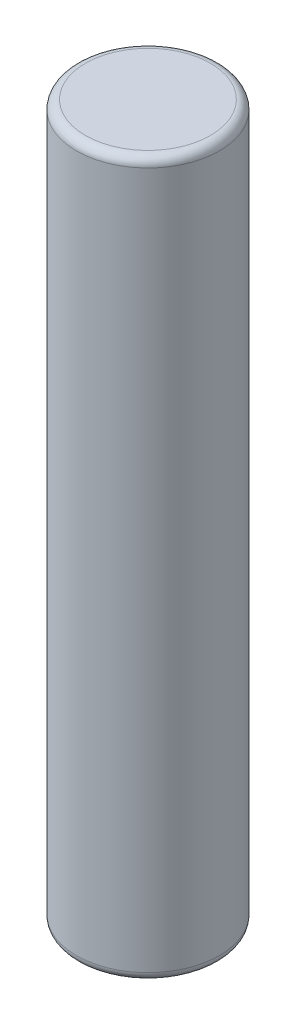
ISO-10303-21;
HEADER;
FILE_DESCRIPTION(('STEP AP214'),'2;1');
FILE_NAME('part.step','',(''),(''),'','','');
FILE_SCHEMA(('AUTOMOTIVE_DESIGN { 1 0 10303 214 1 1 1 1 }'));
ENDSEC;
DATA;
#1=APPLICATION_CONTEXT('core data for automotive mechanical design processes');
#2=APPLICATION_PROTOCOL_DEFINITION('international standard','automotive_design',2000,#1);
#3=PRODUCT_CONTEXT('',#1,'mechanical');
#4=PRODUCT('Part','Part','',(#3));
#5=PRODUCT_RELATED_PRODUCT_CATEGORY('part','',(#4));
#6=PRODUCT_DEFINITION_FORMATION('','',#4);
#7=PRODUCT_DEFINITION_CONTEXT('part definition',#1,'design');
#8=PRODUCT_DEFINITION('design','',#6,#7);
#9=PRODUCT_DEFINITION_SHAPE('','',#8);
#10=(LENGTH_UNIT() NAMED_UNIT(*) SI_UNIT(.MILLI.,.METRE.));
#11=(NAMED_UNIT(*) PLANE_ANGLE_UNIT() SI_UNIT($,.RADIAN.));
#12=(NAMED_UNIT(*) SI_UNIT($,.STERADIAN.) SOLID_ANGLE_UNIT());
#13=UNCERTAINTY_MEASURE_WITH_UNIT(LENGTH_MEASURE(1.E-05),#10,'distance_accuracy_value','');
#14=(GEOMETRIC_REPRESENTATION_CONTEXT(3) GLOBAL_UNCERTAINTY_ASSIGNED_CONTEXT((#13)) GLOBAL_UNIT_ASSIGNED_CONTEXT((#10,
#11,#12)) REPRESENTATION_CONTEXT('',''));
#15=CARTESIAN_POINT('',(0.,0.,0.));
#16=DIRECTION('',(0.,0.,1.));
#17=DIRECTION('',(1.,0.,0.));
#18=AXIS2_PLACEMENT_3D('',#15,#16,#17);
#19=CARTESIAN_POINT('',(0.,40.,-0.718171430007214));
#20=DIRECTION('',(0.,-1.,0.));
#21=DIRECTION('',(0.,0.,-1.));
#22=AXIS2_PLACEMENT_3D('',#19,#20,#21);
#23=CYLINDRICAL_SURFACE('',#22,4.);
#24=CARTESIAN_POINT('',(0.,0.5,-0.718171430007214));
#25=DIRECTION('',(0.,1.,0.));
#26=DIRECTION('',(0.,0.,1.));
#27=AXIS2_PLACEMENT_3D('',#24,#25,#26);
#28=CIRCLE('',#27,4.);
#29=CARTESIAN_POINT('',(0.,0.5,3.28182856999279));
#30=VERTEX_POINT('',#29);
#31=EDGE_CURVE('E50',#30,#30,#28,.T.);
#32=ORIENTED_EDGE('',*,*,#31,.T.);
#33=EDGE_LOOP('',(#32));
#34=FACE_BOUND('',#33,.T.);
#35=CARTESIAN_POINT('',(0.,39.5,-0.718171430007214));
#36=DIRECTION('',(0.,1.,0.));
#37=DIRECTION('',(0.,0.,1.));
#38=AXIS2_PLACEMENT_3D('',#35,#36,#37);
#39=CIRCLE('',#38,4.);
#40=CARTESIAN_POINT('',(0.,39.5,3.28182856999279));
#41=VERTEX_POINT('',#40);
#42=EDGE_CURVE('E55',#41,#41,#39,.F.);
#43=ORIENTED_EDGE('',*,*,#42,.T.);
#44=EDGE_LOOP('',(#43));
#45=FACE_BOUND('',#44,.T.);
#46=ADVANCED_FACE('F37',(#34,#45),#23,.T.);
#47=CARTESIAN_POINT('',(0.,40.,-0.718171430007214));
#48=DIRECTION('',(0.,1.,0.));
#49=DIRECTION('',(0.,0.,1.));
#50=AXIS2_PLACEMENT_3D('',#47,#48,#49);
#51=PLANE('',#50);
#52=CARTESIAN_POINT('',(0.,40.,-0.718171430007214));
#53=DIRECTION('',(0.,1.,0.));
#54=DIRECTION('',(0.,0.,1.));
#55=AXIS2_PLACEMENT_3D('',#52,#53,#54);
#56=CIRCLE('',#55,3.5);
#57=CARTESIAN_POINT('',(0.,40.,2.78182856999279));
#58=VERTEX_POINT('',#57);
#59=EDGE_CURVE('E10',#58,#58,#56,.T.);
#60=ORIENTED_EDGE('',*,*,#59,.T.);
#61=EDGE_LOOP('',(#60));
#62=FACE_BOUND('',#61,.T.);
#63=ADVANCED_FACE('F72',(#62),#51,.T.);
#64=CARTESIAN_POINT('',(0.,0.,-0.718171430007214));
#65=DIRECTION('',(0.,1.,0.));
#66=DIRECTION('',(0.,0.,1.));
#67=AXIS2_PLACEMENT_3D('',#64,#65,#66);
#68=PLANE('',#67);
#69=CARTESIAN_POINT('',(0.,0.,-0.718171430007214));
#70=DIRECTION('',(0.,1.,0.));
#71=DIRECTION('',(0.,0.,1.));
#72=AXIS2_PLACEMENT_3D('',#69,#70,#71);
#73=CIRCLE('',#72,3.5);
#74=CARTESIAN_POINT('',(0.,0.,2.78182856999279));
#75=VERTEX_POINT('',#74);
#76=EDGE_CURVE('E45',#75,#75,#73,.F.);
#77=ORIENTED_EDGE('',*,*,#76,.T.);
#78=EDGE_LOOP('',(#77));
#79=FACE_BOUND('',#78,.T.);
#80=ADVANCED_FACE('F69',(#79),#68,.F.);
#81=CARTESIAN_POINT('',(0.,0.5,-0.718171430007214));
#82=DIRECTION('',(0.,1.,0.));
#83=DIRECTION('',(0.,0.,1.));
#84=AXIS2_PLACEMENT_3D('',#81,#82,#83);
#85=TOROIDAL_SURFACE('',#84,3.5,0.5);
#86=ORIENTED_EDGE('',*,*,#76,.F.);
#87=EDGE_LOOP('',(#86));
#88=FACE_BOUND('',#87,.T.);
#89=ORIENTED_EDGE('',*,*,#31,.F.);
#90=EDGE_LOOP('',(#89));
#91=FACE_BOUND('',#90,.T.);
#92=ADVANCED_FACE('F65',(#88,#91),#85,.T.);
#93=CARTESIAN_POINT('',(0.,39.5,-0.718171430007214));
#94=DIRECTION('',(0.,1.,0.));
#95=DIRECTION('',(0.,0.,1.));
#96=AXIS2_PLACEMENT_3D('',#93,#94,#95);
#97=TOROIDAL_SURFACE('',#96,3.5,0.5);
#98=ORIENTED_EDGE('',*,*,#42,.F.);
#99=EDGE_LOOP('',(#98));
#100=FACE_BOUND('',#99,.T.);
#101=ORIENTED_EDGE('',*,*,#59,.F.);
#102=EDGE_LOOP('',(#101));
#103=FACE_BOUND('',#102,.T.);
#104=ADVANCED_FACE('F39',(#100,#103),#97,.T.);
#105=CLOSED_SHELL('',(#46,#63,#80,#92,#104));
#106=MANIFOLD_SOLID_BREP('B2',#105);
#107=ADVANCED_BREP_SHAPE_REPRESENTATION('',(#18,#106),#14);
#108=SHAPE_DEFINITION_REPRESENTATION(#9,#107);
ENDSEC;
END-ISO-10303-21;
